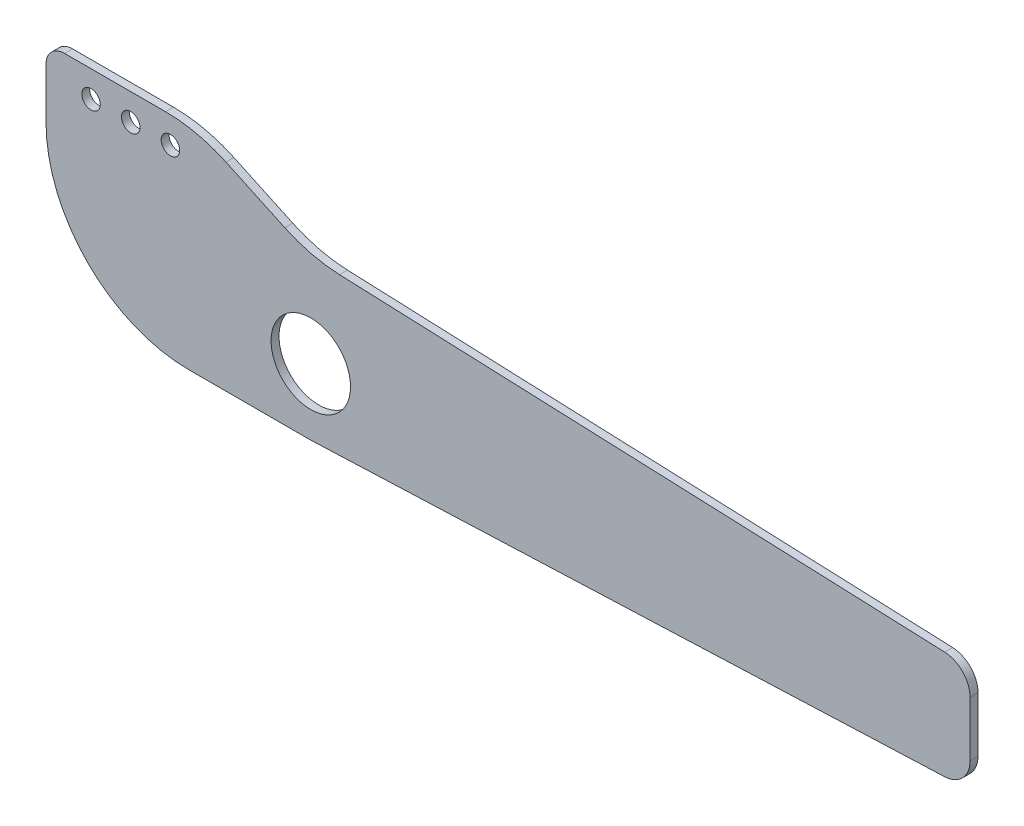
ISO-10303-21;
HEADER;
FILE_DESCRIPTION(('STEP AP214'),'2;1');
FILE_NAME('part.step','',(''),(''),'','','');
FILE_SCHEMA(('AUTOMOTIVE_DESIGN { 1 0 10303 214 1 1 1 1 }'));
ENDSEC;
DATA;
#1=APPLICATION_CONTEXT('core data for automotive mechanical design processes');
#2=APPLICATION_PROTOCOL_DEFINITION('international standard','automotive_design',2000,#1);
#3=PRODUCT_CONTEXT('',#1,'mechanical');
#4=PRODUCT('Part','Part','',(#3));
#5=PRODUCT_RELATED_PRODUCT_CATEGORY('part','',(#4));
#6=PRODUCT_DEFINITION_FORMATION('','',#4);
#7=PRODUCT_DEFINITION_CONTEXT('part definition',#1,'design');
#8=PRODUCT_DEFINITION('design','',#6,#7);
#9=PRODUCT_DEFINITION_SHAPE('','',#8);
#10=(LENGTH_UNIT() NAMED_UNIT(*) SI_UNIT(.MILLI.,.METRE.));
#11=(NAMED_UNIT(*) PLANE_ANGLE_UNIT() SI_UNIT($,.RADIAN.));
#12=(NAMED_UNIT(*) SI_UNIT($,.STERADIAN.) SOLID_ANGLE_UNIT());
#13=UNCERTAINTY_MEASURE_WITH_UNIT(LENGTH_MEASURE(1.E-05),#10,'distance_accuracy_value','');
#14=(GEOMETRIC_REPRESENTATION_CONTEXT(3) GLOBAL_UNCERTAINTY_ASSIGNED_CONTEXT((#13)) GLOBAL_UNIT_ASSIGNED_CONTEXT((#10,
#11,#12)) REPRESENTATION_CONTEXT('',''));
#15=CARTESIAN_POINT('',(0.,0.,0.));
#16=DIRECTION('',(0.,0.,1.));
#17=DIRECTION('',(1.,0.,0.));
#18=AXIS2_PLACEMENT_3D('',#15,#16,#17);
#19=CARTESIAN_POINT('',(100.,0.,3.));
#20=DIRECTION('',(0.,1.,0.));
#21=DIRECTION('',(0.,0.,1.));
#22=AXIS2_PLACEMENT_3D('',#19,#20,#21);
#23=PLANE('',#22);
#24=DIRECTION('',(1.,0.,0.));
#25=VECTOR('',#24,1.);
#26=CARTESIAN_POINT('',(100.,0.,3.));
#27=LINE('',#26,#25);
#28=CARTESIAN_POINT('',(54.,0.,3.));
#29=VERTEX_POINT('',#28);
#30=CARTESIAN_POINT('',(100.,0.,3.));
#31=VERTEX_POINT('',#30);
#32=EDGE_CURVE('E140',#29,#31,#27,.T.);
#33=ORIENTED_EDGE('',*,*,#32,.F.);
#34=DIRECTION('',(0.,0.,-1.));
#35=VECTOR('',#34,1.);
#36=CARTESIAN_POINT('',(54.,0.,3.));
#37=LINE('',#36,#35);
#38=CARTESIAN_POINT('',(54.,0.,0.));
#39=VERTEX_POINT('',#38);
#40=EDGE_CURVE('E206',#29,#39,#37,.T.);
#41=ORIENTED_EDGE('',*,*,#40,.T.);
#42=DIRECTION('',(1.,0.,0.));
#43=VECTOR('',#42,1.);
#44=CARTESIAN_POINT('',(100.,0.,0.));
#45=LINE('',#44,#43);
#46=CARTESIAN_POINT('',(100.,0.,0.));
#47=VERTEX_POINT('',#46);
#48=EDGE_CURVE('E165',#39,#47,#45,.T.);
#49=ORIENTED_EDGE('',*,*,#48,.T.);
#50=DIRECTION('',(0.,0.,-1.));
#51=VECTOR('',#50,1.);
#52=CARTESIAN_POINT('',(100.,0.,3.));
#53=LINE('',#52,#51);
#54=EDGE_CURVE('E158',#31,#47,#53,.T.);
#55=ORIENTED_EDGE('',*,*,#54,.F.);
#56=EDGE_LOOP('',(#33,#41,#49,#55));
#57=FACE_BOUND('',#56,.T.);
#58=ADVANCED_FACE('F47',(#57),#23,.F.);
#59=CARTESIAN_POINT('',(348.978261886474,9.99999999999916,3.));
#60=DIRECTION('',(-0.040131792532553,0.999194395114446,0.));
#61=DIRECTION('',(-0.999194395114446,-0.040131792532553,0.));
#62=AXIS2_PLACEMENT_3D('',#59,#60,#61);
#63=PLANE('',#62);
#64=DIRECTION('',(0.999194395114446,0.040131792532553,0.));
#65=VECTOR('',#64,1.);
#66=CARTESIAN_POINT('',(348.978261886474,9.99999999999916,0.));
#67=LINE('',#66,#65);
#68=CARTESIAN_POINT('',(339.3795798118,9.61447710326328,0.));
#69=VERTEX_POINT('',#68);
#70=EDGE_CURVE('E314',#47,#69,#67,.T.);
#71=ORIENTED_EDGE('',*,*,#70,.T.);
#72=DIRECTION('',(0.,0.,-1.));
#73=VECTOR('',#72,1.);
#74=CARTESIAN_POINT('',(339.3795798118,9.61447710326328,3.));
#75=LINE('',#74,#73);
#76=CARTESIAN_POINT('',(339.3795798118,9.61447710326328,3.));
#77=VERTEX_POINT('',#76);
#78=EDGE_CURVE('E160',#69,#77,#75,.F.);
#79=ORIENTED_EDGE('',*,*,#78,.T.);
#80=DIRECTION('',(0.999194395114446,0.040131792532553,0.));
#81=VECTOR('',#80,1.);
#82=CARTESIAN_POINT('',(348.978261886474,9.99999999999916,3.));
#83=LINE('',#82,#81);
#84=EDGE_CURVE('E143',#31,#77,#83,.T.);
#85=ORIENTED_EDGE('',*,*,#84,.F.);
#86=ORIENTED_EDGE('',*,*,#54,.T.);
#87=EDGE_LOOP('',(#71,#79,#85,#86));
#88=FACE_BOUND('',#87,.T.);
#89=ADVANCED_FACE('F157',(#88),#63,.F.);
#90=CARTESIAN_POINT('',(348.978261886474,49.9999999999992,3.));
#91=DIRECTION('',(-1.,0.,0.));
#92=DIRECTION('',(0.,0.,1.));
#93=AXIS2_PLACEMENT_3D('',#90,#91,#92);
#94=PLANE('',#93);
#95=DIRECTION('',(0.,1.,0.));
#96=VECTOR('',#95,1.);
#97=CARTESIAN_POINT('',(348.978261886474,49.9999999999992,0.));
#98=LINE('',#97,#96);
#99=CARTESIAN_POINT('',(348.978261886474,19.6064210544077,0.));
#100=VERTEX_POINT('',#99);
#101=CARTESIAN_POINT('',(348.978261886474,40.3935789455906,0.));
#102=VERTEX_POINT('',#101);
#103=EDGE_CURVE('E317',#100,#102,#98,.T.);
#104=ORIENTED_EDGE('',*,*,#103,.T.);
#105=DIRECTION('',(0.,0.,-1.));
#106=VECTOR('',#105,1.);
#107=CARTESIAN_POINT('',(348.978261886474,40.3935789455906,3.));
#108=LINE('',#107,#106);
#109=CARTESIAN_POINT('',(348.978261886474,40.3935789455906,3.));
#110=VERTEX_POINT('',#109);
#111=EDGE_CURVE('E233',#102,#110,#108,.F.);
#112=ORIENTED_EDGE('',*,*,#111,.T.);
#113=DIRECTION('',(0.,1.,0.));
#114=VECTOR('',#113,1.);
#115=CARTESIAN_POINT('',(348.978261886474,49.9999999999992,3.));
#116=LINE('',#115,#114);
#117=CARTESIAN_POINT('',(348.978261886474,19.6064210544077,3.));
#118=VERTEX_POINT('',#117);
#119=EDGE_CURVE('E162',#118,#110,#116,.T.);
#120=ORIENTED_EDGE('',*,*,#119,.F.);
#121=DIRECTION('',(0.,0.,-1.));
#122=VECTOR('',#121,1.);
#123=CARTESIAN_POINT('',(348.978261886474,19.6064210544077,3.));
#124=LINE('',#123,#122);
#125=EDGE_CURVE('E229',#118,#100,#124,.T.);
#126=ORIENTED_EDGE('',*,*,#125,.T.);
#127=EDGE_LOOP('',(#104,#112,#120,#126));
#128=FACE_BOUND('',#127,.T.);
#129=ADVANCED_FACE('F353',(#128),#94,.F.);
#130=CARTESIAN_POINT('',(100.,60.,3.));
#131=DIRECTION('',(-0.0401317925325598,-0.999194395114446,0.));
#132=DIRECTION('',(0.999194395114446,-0.0401317925325598,0.));
#133=AXIS2_PLACEMENT_3D('',#130,#131,#132);
#134=PLANE('',#133);
#135=DIRECTION('',(-0.999194395114446,0.0401317925325598,0.));
#136=VECTOR('',#135,1.);
#137=CARTESIAN_POINT('',(100.,60.,3.));
#138=LINE('',#137,#136);
#139=CARTESIAN_POINT('',(339.3795798118,50.3855228967351,3.));
#140=VERTEX_POINT('',#139);
#141=CARTESIAN_POINT('',(110.830546587806,59.5650003134513,3.));
#142=VERTEX_POINT('',#141);
#143=EDGE_CURVE('E177',#140,#142,#138,.T.);
#144=ORIENTED_EDGE('',*,*,#143,.F.);
#145=DIRECTION('',(0.,0.,-1.));
#146=VECTOR('',#145,1.);
#147=CARTESIAN_POINT('',(339.3795798118,50.3855228967351,3.));
#148=LINE('',#147,#146);
#149=CARTESIAN_POINT('',(339.3795798118,50.3855228967351,0.));
#150=VERTEX_POINT('',#149);
#151=EDGE_CURVE('E219',#140,#150,#148,.T.);
#152=ORIENTED_EDGE('',*,*,#151,.T.);
#153=DIRECTION('',(-0.999194395114446,0.0401317925325598,0.));
#154=VECTOR('',#153,1.);
#155=CARTESIAN_POINT('',(100.,60.,0.));
#156=LINE('',#155,#154);
#157=CARTESIAN_POINT('',(110.830546587806,59.5650003134513,0.));
#158=VERTEX_POINT('',#157);
#159=EDGE_CURVE('E320',#150,#158,#156,.T.);
#160=ORIENTED_EDGE('',*,*,#159,.T.);
#161=DIRECTION('',(0.,0.,-1.));
#162=VECTOR('',#161,1.);
#163=CARTESIAN_POINT('',(110.830546587806,59.5650003134513,3.));
#164=LINE('',#163,#162);
#165=EDGE_CURVE('E185',#158,#142,#164,.F.);
#166=ORIENTED_EDGE('',*,*,#165,.T.);
#167=EDGE_LOOP('',(#144,#152,#160,#166));
#168=FACE_BOUND('',#167,.T.);
#169=ADVANCED_FACE('F429',(#168),#134,.F.);
#170=CARTESIAN_POINT('',(0.,0.,3.));
#171=DIRECTION('',(1.,0.,0.));
#172=DIRECTION('',(0.,0.,-1.));
#173=AXIS2_PLACEMENT_3D('',#170,#171,#172);
#174=PLANE('',#173);
#175=DIRECTION('',(0.,-1.,0.));
#176=VECTOR('',#175,1.);
#177=CARTESIAN_POINT('',(0.,0.,3.));
#178=LINE('',#177,#176);
#179=CARTESIAN_POINT('',(0.,73.,3.));
#180=VERTEX_POINT('',#179);
#181=CARTESIAN_POINT('',(0.,54.,3.));
#182=VERTEX_POINT('',#181);
#183=EDGE_CURVE('E169',#180,#182,#178,.T.);
#184=ORIENTED_EDGE('',*,*,#183,.F.);
#185=DIRECTION('',(0.,0.,1.));
#186=VECTOR('',#185,1.);
#187=CARTESIAN_POINT('',(0.,73.,0.));
#188=LINE('',#187,#186);
#189=CARTESIAN_POINT('',(0.,73.,0.));
#190=VERTEX_POINT('',#189);
#191=EDGE_CURVE('E56',#180,#190,#188,.F.);
#192=ORIENTED_EDGE('',*,*,#191,.T.);
#193=DIRECTION('',(0.,-1.,0.));
#194=VECTOR('',#193,1.);
#195=CARTESIAN_POINT('',(0.,0.,0.));
#196=LINE('',#195,#194);
#197=CARTESIAN_POINT('',(0.,54.,0.));
#198=VERTEX_POINT('',#197);
#199=EDGE_CURVE('E152',#190,#198,#196,.T.);
#200=ORIENTED_EDGE('',*,*,#199,.T.);
#201=DIRECTION('',(0.,0.,-1.));
#202=VECTOR('',#201,1.);
#203=CARTESIAN_POINT('',(0.,54.,3.));
#204=LINE('',#203,#202);
#205=EDGE_CURVE('E213',#198,#182,#204,.F.);
#206=ORIENTED_EDGE('',*,*,#205,.T.);
#207=EDGE_LOOP('',(#184,#192,#200,#206));
#208=FACE_BOUND('',#207,.T.);
#209=ADVANCED_FACE('F327',(#208),#174,.F.);
#210=CARTESIAN_POINT('',(0.,0.,3.));
#211=DIRECTION('',(0.,0.,-1.));
#212=DIRECTION('',(-1.,0.,0.));
#213=AXIS2_PLACEMENT_3D('',#210,#211,#212);
#214=PLANE('',#213);
#215=CARTESIAN_POINT('',(47.,70.,3.));
#216=DIRECTION('',(0.,0.,1.));
#217=DIRECTION('',(1.,0.,0.));
#218=AXIS2_PLACEMENT_3D('',#215,#216,#217);
#219=CIRCLE('',#218,3.5);
#220=CARTESIAN_POINT('',(50.5,70.,3.));
#221=VERTEX_POINT('',#220);
#222=EDGE_CURVE('E294',#221,#221,#219,.T.);
#223=ORIENTED_EDGE('',*,*,#222,.F.);
#224=EDGE_LOOP('',(#223));
#225=FACE_BOUND('',#224,.T.);
#226=CARTESIAN_POINT('',(32.,70.,3.));
#227=DIRECTION('',(0.,0.,1.));
#228=DIRECTION('',(1.,0.,0.));
#229=AXIS2_PLACEMENT_3D('',#226,#227,#228);
#230=CIRCLE('',#229,3.5);
#231=CARTESIAN_POINT('',(35.5,70.,3.));
#232=VERTEX_POINT('',#231);
#233=EDGE_CURVE('E385',#232,#232,#230,.T.);
#234=ORIENTED_EDGE('',*,*,#233,.F.);
#235=EDGE_LOOP('',(#234));
#236=FACE_BOUND('',#235,.T.);
#237=CARTESIAN_POINT('',(17.,70.,3.));
#238=DIRECTION('',(0.,0.,1.));
#239=DIRECTION('',(1.,0.,0.));
#240=AXIS2_PLACEMENT_3D('',#237,#238,#239);
#241=CIRCLE('',#240,3.5);
#242=CARTESIAN_POINT('',(20.5,70.,3.));
#243=VERTEX_POINT('',#242);
#244=EDGE_CURVE('E392',#243,#243,#241,.T.);
#245=ORIENTED_EDGE('',*,*,#244,.F.);
#246=EDGE_LOOP('',(#245));
#247=FACE_BOUND('',#246,.T.);
#248=CARTESIAN_POINT('',(100.,24.9999999999992,3.));
#249=DIRECTION('',(0.,0.,1.));
#250=DIRECTION('',(1.,0.,0.));
#251=AXIS2_PLACEMENT_3D('',#248,#249,#250);
#252=CIRCLE('',#251,15.);
#253=CARTESIAN_POINT('',(115.,24.9999999999992,3.));
#254=VERTEX_POINT('',#253);
#255=EDGE_CURVE('E291',#254,#254,#252,.T.);
#256=ORIENTED_EDGE('',*,*,#255,.F.);
#257=EDGE_LOOP('',(#256));
#258=FACE_BOUND('',#257,.T.);
#259=DIRECTION('',(1.,0.,0.));
#260=VECTOR('',#259,1.);
#261=CARTESIAN_POINT('',(0.,80.,3.));
#262=LINE('',#261,#260);
#263=CARTESIAN_POINT('',(7.,80.,3.));
#264=VERTEX_POINT('',#263);
#265=CARTESIAN_POINT('',(45.1383498070895,80.,3.));
#266=VERTEX_POINT('',#265);
#267=EDGE_CURVE('E278',#264,#266,#262,.T.);
#268=ORIENTED_EDGE('',*,*,#267,.F.);
#269=CARTESIAN_POINT('',(7.,73.,3.));
#270=DIRECTION('',(0.,0.,-1.));
#271=DIRECTION('',(-1.,0.,0.));
#272=AXIS2_PLACEMENT_3D('',#269,#270,#271);
#273=CIRCLE('',#272,7.);
#274=EDGE_CURVE('E70',#264,#180,#273,.F.);
#275=ORIENTED_EDGE('',*,*,#274,.T.);
#276=ORIENTED_EDGE('',*,*,#183,.T.);
#277=CARTESIAN_POINT('',(54.,54.,3.));
#278=DIRECTION('',(0.,0.,-1.));
#279=DIRECTION('',(-1.,0.,0.));
#280=AXIS2_PLACEMENT_3D('',#277,#278,#279);
#281=CIRCLE('',#280,54.);
#282=EDGE_CURVE('E146',#182,#29,#281,.F.);
#283=ORIENTED_EDGE('',*,*,#282,.T.);
#284=ORIENTED_EDGE('',*,*,#32,.T.);
#285=ORIENTED_EDGE('',*,*,#84,.T.);
#286=CARTESIAN_POINT('',(338.978261886474,19.6064210544077,3.));
#287=DIRECTION('',(0.,0.,-1.));
#288=DIRECTION('',(-1.,0.,0.));
#289=AXIS2_PLACEMENT_3D('',#286,#287,#288);
#290=CIRCLE('',#289,9.99999999999999);
#291=EDGE_CURVE('E236',#77,#118,#290,.F.);
#292=ORIENTED_EDGE('',*,*,#291,.T.);
#293=ORIENTED_EDGE('',*,*,#119,.T.);
#294=CARTESIAN_POINT('',(338.978261886474,40.3935789455906,3.));
#295=DIRECTION('',(0.,0.,-1.));
#296=DIRECTION('',(-1.,0.,0.));
#297=AXIS2_PLACEMENT_3D('',#294,#295,#296);
#298=CIRCLE('',#297,9.99999999999999);
#299=EDGE_CURVE('E239',#110,#140,#298,.F.);
#300=ORIENTED_EDGE('',*,*,#299,.T.);
#301=ORIENTED_EDGE('',*,*,#143,.T.);
#302=CARTESIAN_POINT('',(112.997663384564,113.521497649631,3.));
#303=DIRECTION('',(0.,0.,-1.));
#304=DIRECTION('',(-1.,0.,0.));
#305=AXIS2_PLACEMENT_3D('',#302,#303,#304);
#306=CIRCLE('',#305,54.);
#307=CARTESIAN_POINT('',(90.1762772505669,64.5808771496521,3.));
#308=VERTEX_POINT('',#307);
#309=EDGE_CURVE('E203',#142,#308,#306,.T.);
#310=ORIENTED_EDGE('',*,*,#309,.T.);
#311=DIRECTION('',(0.906307787036653,-0.422618261740693,0.));
#312=VECTOR('',#311,1.);
#313=CARTESIAN_POINT('',(100.,60.,3.));
#314=LINE('',#313,#312);
#315=CARTESIAN_POINT('',(67.9597359410869,74.9406204999793,3.));
#316=VERTEX_POINT('',#315);
#317=EDGE_CURVE('E370',#316,#308,#314,.T.);
#318=ORIENTED_EDGE('',*,*,#317,.F.);
#319=CARTESIAN_POINT('',(45.1383498070895,26.,3.));
#320=DIRECTION('',(0.,0.,-1.));
#321=DIRECTION('',(-1.,0.,0.));
#322=AXIS2_PLACEMENT_3D('',#319,#320,#321);
#323=CIRCLE('',#322,54.);
#324=EDGE_CURVE('E189',#316,#266,#323,.F.);
#325=ORIENTED_EDGE('',*,*,#324,.T.);
#326=EDGE_LOOP('',(#268,#275,#276,#283,#284,#285,#292,#293,#300,#301,#310,#318,#325));
#327=FACE_BOUND('',#326,.T.);
#328=ADVANCED_FACE('F142',(#225,#236,#247,#258,#327),#214,.F.);
#329=CARTESIAN_POINT('',(0.,0.,0.));
#330=DIRECTION('',(0.,0.,-1.));
#331=DIRECTION('',(-1.,0.,0.));
#332=AXIS2_PLACEMENT_3D('',#329,#330,#331);
#333=PLANE('',#332);
#334=ORIENTED_EDGE('',*,*,#199,.F.);
#335=CARTESIAN_POINT('',(7.,73.,0.));
#336=DIRECTION('',(0.,0.,-1.));
#337=DIRECTION('',(-1.,0.,0.));
#338=AXIS2_PLACEMENT_3D('',#335,#336,#337);
#339=CIRCLE('',#338,7.);
#340=CARTESIAN_POINT('',(7.,80.,0.));
#341=VERTEX_POINT('',#340);
#342=EDGE_CURVE('E11',#190,#341,#339,.T.);
#343=ORIENTED_EDGE('',*,*,#342,.T.);
#344=DIRECTION('',(-1.,0.,0.));
#345=VECTOR('',#344,1.);
#346=CARTESIAN_POINT('',(0.,80.,0.));
#347=LINE('',#346,#345);
#348=CARTESIAN_POINT('',(45.1383498070895,80.,0.));
#349=VERTEX_POINT('',#348);
#350=EDGE_CURVE('E280',#349,#341,#347,.T.);
#351=ORIENTED_EDGE('',*,*,#350,.F.);
#352=CARTESIAN_POINT('',(45.1383498070895,26.,0.));
#353=DIRECTION('',(0.,0.,-1.));
#354=DIRECTION('',(-1.,0.,0.));
#355=AXIS2_PLACEMENT_3D('',#352,#353,#354);
#356=CIRCLE('',#355,54.);
#357=CARTESIAN_POINT('',(67.9597359410869,74.9406204999793,0.));
#358=VERTEX_POINT('',#357);
#359=EDGE_CURVE('E196',#349,#358,#356,.T.);
#360=ORIENTED_EDGE('',*,*,#359,.T.);
#361=DIRECTION('',(0.906307787036653,-0.422618261740693,0.));
#362=VECTOR('',#361,1.);
#363=CARTESIAN_POINT('',(100.,60.,0.));
#364=LINE('',#363,#362);
#365=CARTESIAN_POINT('',(90.1762772505669,64.5808771496521,0.));
#366=VERTEX_POINT('',#365);
#367=EDGE_CURVE('E376',#358,#366,#364,.T.);
#368=ORIENTED_EDGE('',*,*,#367,.T.);
#369=CARTESIAN_POINT('',(112.997663384564,113.521497649631,0.));
#370=DIRECTION('',(0.,0.,-1.));
#371=DIRECTION('',(-1.,0.,0.));
#372=AXIS2_PLACEMENT_3D('',#369,#370,#371);
#373=CIRCLE('',#372,54.);
#374=EDGE_CURVE('E199',#366,#158,#373,.F.);
#375=ORIENTED_EDGE('',*,*,#374,.T.);
#376=ORIENTED_EDGE('',*,*,#159,.F.);
#377=CARTESIAN_POINT('',(338.978261886474,40.3935789455906,0.));
#378=DIRECTION('',(0.,0.,-1.));
#379=DIRECTION('',(-1.,0.,0.));
#380=AXIS2_PLACEMENT_3D('',#377,#378,#379);
#381=CIRCLE('',#380,9.99999999999999);
#382=EDGE_CURVE('E226',#150,#102,#381,.T.);
#383=ORIENTED_EDGE('',*,*,#382,.T.);
#384=ORIENTED_EDGE('',*,*,#103,.F.);
#385=CARTESIAN_POINT('',(338.978261886474,19.6064210544077,0.));
#386=DIRECTION('',(0.,0.,-1.));
#387=DIRECTION('',(-1.,0.,0.));
#388=AXIS2_PLACEMENT_3D('',#385,#386,#387);
#389=CIRCLE('',#388,9.99999999999999);
#390=EDGE_CURVE('E223',#100,#69,#389,.T.);
#391=ORIENTED_EDGE('',*,*,#390,.T.);
#392=ORIENTED_EDGE('',*,*,#70,.F.);
#393=ORIENTED_EDGE('',*,*,#48,.F.);
#394=CARTESIAN_POINT('',(54.,54.,0.));
#395=DIRECTION('',(0.,0.,-1.));
#396=DIRECTION('',(-1.,0.,0.));
#397=AXIS2_PLACEMENT_3D('',#394,#395,#396);
#398=CIRCLE('',#397,54.);
#399=EDGE_CURVE('E209',#39,#198,#398,.T.);
#400=ORIENTED_EDGE('',*,*,#399,.T.);
#401=EDGE_LOOP('',(#334,#343,#351,#360,#368,#375,#376,#383,#384,#391,#392,#393,#400));
#402=FACE_BOUND('',#401,.T.);
#403=CARTESIAN_POINT('',(47.,70.,0.));
#404=DIRECTION('',(0.,0.,1.));
#405=DIRECTION('',(1.,0.,0.));
#406=AXIS2_PLACEMENT_3D('',#403,#404,#405);
#407=CIRCLE('',#406,3.5);
#408=CARTESIAN_POINT('',(50.5,70.,0.));
#409=VERTEX_POINT('',#408);
#410=EDGE_CURVE('E286',#409,#409,#407,.T.);
#411=ORIENTED_EDGE('',*,*,#410,.T.);
#412=EDGE_LOOP('',(#411));
#413=FACE_BOUND('',#412,.T.);
#414=CARTESIAN_POINT('',(32.,70.,0.));
#415=DIRECTION('',(0.,0.,1.));
#416=DIRECTION('',(1.,0.,0.));
#417=AXIS2_PLACEMENT_3D('',#414,#415,#416);
#418=CIRCLE('',#417,3.5);
#419=CARTESIAN_POINT('',(35.5,70.,0.));
#420=VERTEX_POINT('',#419);
#421=EDGE_CURVE('E389',#420,#420,#418,.T.);
#422=ORIENTED_EDGE('',*,*,#421,.T.);
#423=EDGE_LOOP('',(#422));
#424=FACE_BOUND('',#423,.T.);
#425=CARTESIAN_POINT('',(17.,70.,0.));
#426=DIRECTION('',(0.,0.,1.));
#427=DIRECTION('',(1.,0.,0.));
#428=AXIS2_PLACEMENT_3D('',#425,#426,#427);
#429=CIRCLE('',#428,3.5);
#430=CARTESIAN_POINT('',(20.5,70.,0.));
#431=VERTEX_POINT('',#430);
#432=EDGE_CURVE('E297',#431,#431,#429,.T.);
#433=ORIENTED_EDGE('',*,*,#432,.T.);
#434=EDGE_LOOP('',(#433));
#435=FACE_BOUND('',#434,.T.);
#436=CARTESIAN_POINT('',(100.,24.9999999999992,0.));
#437=DIRECTION('',(0.,0.,1.));
#438=DIRECTION('',(1.,0.,0.));
#439=AXIS2_PLACEMENT_3D('',#436,#437,#438);
#440=CIRCLE('',#439,15.);
#441=CARTESIAN_POINT('',(115.,24.9999999999992,0.));
#442=VERTEX_POINT('',#441);
#443=EDGE_CURVE('E300',#442,#442,#440,.T.);
#444=ORIENTED_EDGE('',*,*,#443,.T.);
#445=EDGE_LOOP('',(#444));
#446=FACE_BOUND('',#445,.T.);
#447=ADVANCED_FACE('F330',(#402,#413,#424,#435,#446),#333,.T.);
#448=CARTESIAN_POINT('',(100.,24.9999999999992,0.));
#449=DIRECTION('',(0.,0.,1.));
#450=DIRECTION('',(1.,0.,0.));
#451=AXIS2_PLACEMENT_3D('',#448,#449,#450);
#452=CYLINDRICAL_SURFACE('',#451,15.);
#453=ORIENTED_EDGE('',*,*,#443,.F.);
#454=EDGE_LOOP('',(#453));
#455=FACE_BOUND('',#454,.T.);
#456=ORIENTED_EDGE('',*,*,#255,.T.);
#457=EDGE_LOOP('',(#456));
#458=FACE_BOUND('',#457,.T.);
#459=ADVANCED_FACE('F416',(#455,#458),#452,.F.);
#460=CARTESIAN_POINT('',(0.,80.,0.));
#461=DIRECTION('',(0.,1.,0.));
#462=DIRECTION('',(-1.,0.,0.));
#463=AXIS2_PLACEMENT_3D('',#460,#461,#462);
#464=PLANE('',#463);
#465=ORIENTED_EDGE('',*,*,#350,.T.);
#466=DIRECTION('',(0.,0.,1.));
#467=VECTOR('',#466,1.);
#468=CARTESIAN_POINT('',(7.,80.,3.));
#469=LINE('',#468,#467);
#470=EDGE_CURVE('E244',#341,#264,#469,.T.);
#471=ORIENTED_EDGE('',*,*,#470,.T.);
#472=ORIENTED_EDGE('',*,*,#267,.T.);
#473=DIRECTION('',(0.,0.,1.));
#474=VECTOR('',#473,1.);
#475=CARTESIAN_POINT('',(45.1383498070895,80.,0.));
#476=LINE('',#475,#474);
#477=EDGE_CURVE('E193',#266,#349,#476,.F.);
#478=ORIENTED_EDGE('',*,*,#477,.T.);
#479=EDGE_LOOP('',(#465,#471,#472,#478));
#480=FACE_BOUND('',#479,.T.);
#481=ADVANCED_FACE('F277',(#480),#464,.T.);
#482=CARTESIAN_POINT('',(17.,70.,0.));
#483=DIRECTION('',(0.,0.,1.));
#484=DIRECTION('',(1.,0.,0.));
#485=AXIS2_PLACEMENT_3D('',#482,#483,#484);
#486=CYLINDRICAL_SURFACE('',#485,3.5);
#487=ORIENTED_EDGE('',*,*,#432,.F.);
#488=EDGE_LOOP('',(#487));
#489=FACE_BOUND('',#488,.T.);
#490=ORIENTED_EDGE('',*,*,#244,.T.);
#491=EDGE_LOOP('',(#490));
#492=FACE_BOUND('',#491,.T.);
#493=ADVANCED_FACE('F405',(#489,#492),#486,.F.);
#494=CARTESIAN_POINT('',(32.,70.,0.));
#495=DIRECTION('',(0.,0.,1.));
#496=DIRECTION('',(1.,0.,0.));
#497=AXIS2_PLACEMENT_3D('',#494,#495,#496);
#498=CYLINDRICAL_SURFACE('',#497,3.5);
#499=ORIENTED_EDGE('',*,*,#421,.F.);
#500=EDGE_LOOP('',(#499));
#501=FACE_BOUND('',#500,.T.);
#502=ORIENTED_EDGE('',*,*,#233,.T.);
#503=EDGE_LOOP('',(#502));
#504=FACE_BOUND('',#503,.T.);
#505=ADVANCED_FACE('F407',(#501,#504),#498,.F.);
#506=CARTESIAN_POINT('',(47.,70.,0.));
#507=DIRECTION('',(0.,0.,1.));
#508=DIRECTION('',(1.,0.,0.));
#509=AXIS2_PLACEMENT_3D('',#506,#507,#508);
#510=CYLINDRICAL_SURFACE('',#509,3.5);
#511=ORIENTED_EDGE('',*,*,#410,.F.);
#512=EDGE_LOOP('',(#511));
#513=FACE_BOUND('',#512,.T.);
#514=ORIENTED_EDGE('',*,*,#222,.T.);
#515=EDGE_LOOP('',(#514));
#516=FACE_BOUND('',#515,.T.);
#517=ADVANCED_FACE('F363',(#513,#516),#510,.F.);
#518=CARTESIAN_POINT('',(100.,60.,0.));
#519=DIRECTION('',(-0.422618261740693,-0.906307787036653,0.));
#520=DIRECTION('',(0.906307787036653,-0.422618261740693,0.));
#521=AXIS2_PLACEMENT_3D('',#518,#519,#520);
#522=PLANE('',#521);
#523=ORIENTED_EDGE('',*,*,#317,.T.);
#524=DIRECTION('',(0.,0.,-1.));
#525=VECTOR('',#524,1.);
#526=CARTESIAN_POINT('',(90.1762772505669,64.5808771496521,0.));
#527=LINE('',#526,#525);
#528=EDGE_CURVE('E175',#308,#366,#527,.T.);
#529=ORIENTED_EDGE('',*,*,#528,.T.);
#530=ORIENTED_EDGE('',*,*,#367,.F.);
#531=DIRECTION('',(0.,0.,1.));
#532=VECTOR('',#531,1.);
#533=CARTESIAN_POINT('',(67.9597359410869,74.9406204999793,3.));
#534=LINE('',#533,#532);
#535=EDGE_CURVE('E168',#358,#316,#534,.T.);
#536=ORIENTED_EDGE('',*,*,#535,.T.);
#537=EDGE_LOOP('',(#523,#529,#530,#536));
#538=FACE_BOUND('',#537,.T.);
#539=ADVANCED_FACE('F358',(#538),#522,.F.);
#540=CARTESIAN_POINT('',(112.997663384564,113.521497649631,0.));
#541=DIRECTION('',(0.,0.,1.));
#542=DIRECTION('',(1.,0.,0.));
#543=AXIS2_PLACEMENT_3D('',#540,#541,#542);
#544=CYLINDRICAL_SURFACE('',#543,54.);
#545=ORIENTED_EDGE('',*,*,#309,.F.);
#546=ORIENTED_EDGE('',*,*,#165,.F.);
#547=ORIENTED_EDGE('',*,*,#374,.F.);
#548=ORIENTED_EDGE('',*,*,#528,.F.);
#549=EDGE_LOOP('',(#545,#546,#547,#548));
#550=FACE_BOUND('',#549,.T.);
#551=ADVANCED_FACE('F347',(#550),#544,.F.);
#552=CARTESIAN_POINT('',(45.1383498070895,26.,0.));
#553=DIRECTION('',(0.,0.,-1.));
#554=DIRECTION('',(-1.,0.,0.));
#555=AXIS2_PLACEMENT_3D('',#552,#553,#554);
#556=CYLINDRICAL_SURFACE('',#555,54.);
#557=ORIENTED_EDGE('',*,*,#359,.F.);
#558=ORIENTED_EDGE('',*,*,#477,.F.);
#559=ORIENTED_EDGE('',*,*,#324,.F.);
#560=ORIENTED_EDGE('',*,*,#535,.F.);
#561=EDGE_LOOP('',(#557,#558,#559,#560));
#562=FACE_BOUND('',#561,.T.);
#563=ADVANCED_FACE('F336',(#562),#556,.T.);
#564=CARTESIAN_POINT('',(54.,54.,3.));
#565=DIRECTION('',(0.,0.,-1.));
#566=DIRECTION('',(-1.,0.,0.));
#567=AXIS2_PLACEMENT_3D('',#564,#565,#566);
#568=CYLINDRICAL_SURFACE('',#567,54.);
#569=ORIENTED_EDGE('',*,*,#282,.F.);
#570=ORIENTED_EDGE('',*,*,#205,.F.);
#571=ORIENTED_EDGE('',*,*,#399,.F.);
#572=ORIENTED_EDGE('',*,*,#40,.F.);
#573=EDGE_LOOP('',(#569,#570,#571,#572));
#574=FACE_BOUND('',#573,.T.);
#575=ADVANCED_FACE('F333',(#574),#568,.T.);
#576=CARTESIAN_POINT('',(338.978261886474,40.3935789455906,3.));
#577=DIRECTION('',(0.,0.,-1.));
#578=DIRECTION('',(-1.,0.,0.));
#579=AXIS2_PLACEMENT_3D('',#576,#577,#578);
#580=CYLINDRICAL_SURFACE('',#579,9.99999999999999);
#581=ORIENTED_EDGE('',*,*,#299,.F.);
#582=ORIENTED_EDGE('',*,*,#111,.F.);
#583=ORIENTED_EDGE('',*,*,#382,.F.);
#584=ORIENTED_EDGE('',*,*,#151,.F.);
#585=EDGE_LOOP('',(#581,#582,#583,#584));
#586=FACE_BOUND('',#585,.T.);
#587=ADVANCED_FACE('F335',(#586),#580,.T.);
#588=CARTESIAN_POINT('',(338.978261886474,19.6064210544077,3.));
#589=DIRECTION('',(0.,0.,-1.));
#590=DIRECTION('',(-1.,0.,0.));
#591=AXIS2_PLACEMENT_3D('',#588,#589,#590);
#592=CYLINDRICAL_SURFACE('',#591,9.99999999999999);
#593=ORIENTED_EDGE('',*,*,#291,.F.);
#594=ORIENTED_EDGE('',*,*,#78,.F.);
#595=ORIENTED_EDGE('',*,*,#390,.F.);
#596=ORIENTED_EDGE('',*,*,#125,.F.);
#597=EDGE_LOOP('',(#593,#594,#595,#596));
#598=FACE_BOUND('',#597,.T.);
#599=ADVANCED_FACE('F343',(#598),#592,.T.);
#600=CARTESIAN_POINT('',(7.,73.,0.));
#601=DIRECTION('',(0.,0.,-1.));
#602=DIRECTION('',(-1.,0.,0.));
#603=AXIS2_PLACEMENT_3D('',#600,#601,#602);
#604=CYLINDRICAL_SURFACE('',#603,7.);
#605=ORIENTED_EDGE('',*,*,#342,.F.);
#606=ORIENTED_EDGE('',*,*,#191,.F.);
#607=ORIENTED_EDGE('',*,*,#274,.F.);
#608=ORIENTED_EDGE('',*,*,#470,.F.);
#609=EDGE_LOOP('',(#605,#606,#607,#608));
#610=FACE_BOUND('',#609,.T.);
#611=ADVANCED_FACE('F49',(#610),#604,.T.);
#612=CLOSED_SHELL('',(#58,#89,#129,#169,#209,#328,#447,#459,#481,#493,#505,#517,#539,#551,#563,
#575,#587,#599,#611));
#613=MANIFOLD_SOLID_BREP('B2',#612);
#614=ADVANCED_BREP_SHAPE_REPRESENTATION('',(#18,#613),#14);
#615=SHAPE_DEFINITION_REPRESENTATION(#9,#614);
ENDSEC;
END-ISO-10303-21;
